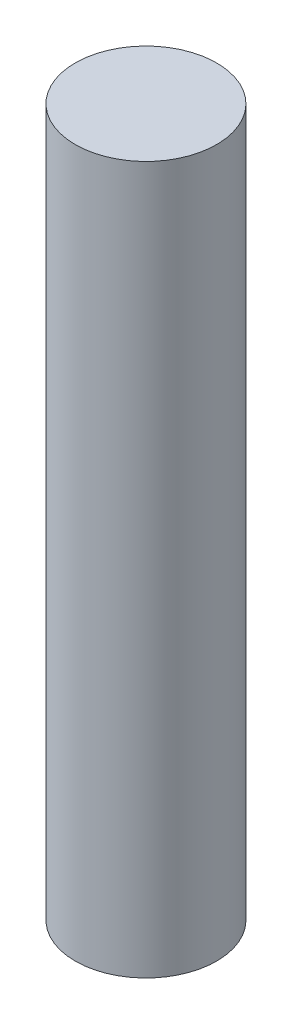
ISO-10303-21;
HEADER;
FILE_DESCRIPTION(('STEP AP214'),'2;1');
FILE_NAME('part.step','',(''),(''),'','','');
FILE_SCHEMA(('AUTOMOTIVE_DESIGN { 1 0 10303 214 1 1 1 1 }'));
ENDSEC;
DATA;
#1=APPLICATION_CONTEXT('core data for automotive mechanical design processes');
#2=APPLICATION_PROTOCOL_DEFINITION('international standard','automotive_design',2000,#1);
#3=PRODUCT_CONTEXT('',#1,'mechanical');
#4=PRODUCT('Part','Part','',(#3));
#5=PRODUCT_RELATED_PRODUCT_CATEGORY('part','',(#4));
#6=PRODUCT_DEFINITION_FORMATION('','',#4);
#7=PRODUCT_DEFINITION_CONTEXT('part definition',#1,'design');
#8=PRODUCT_DEFINITION('design','',#6,#7);
#9=PRODUCT_DEFINITION_SHAPE('','',#8);
#10=(LENGTH_UNIT() NAMED_UNIT(*) SI_UNIT(.MILLI.,.METRE.));
#11=(NAMED_UNIT(*) PLANE_ANGLE_UNIT() SI_UNIT($,.RADIAN.));
#12=(NAMED_UNIT(*) SI_UNIT($,.STERADIAN.) SOLID_ANGLE_UNIT());
#13=UNCERTAINTY_MEASURE_WITH_UNIT(LENGTH_MEASURE(1.E-05),#10,'distance_accuracy_value','');
#14=(GEOMETRIC_REPRESENTATION_CONTEXT(3) GLOBAL_UNCERTAINTY_ASSIGNED_CONTEXT((#13)) GLOBAL_UNIT_ASSIGNED_CONTEXT((#10,
#11,#12)) REPRESENTATION_CONTEXT('',''));
#15=CARTESIAN_POINT('',(0.,0.,0.));
#16=DIRECTION('',(0.,0.,1.));
#17=DIRECTION('',(1.,0.,0.));
#18=AXIS2_PLACEMENT_3D('',#15,#16,#17);
#19=CARTESIAN_POINT('',(0.,13.97,0.));
#20=DIRECTION('',(0.,-1.,0.));
#21=DIRECTION('',(0.,0.,-1.));
#22=AXIS2_PLACEMENT_3D('',#19,#20,#21);
#23=CYLINDRICAL_SURFACE('',#22,1.397);
#24=CARTESIAN_POINT('',(0.,13.97,0.));
#25=DIRECTION('',(0.,1.,0.));
#26=DIRECTION('',(0.,0.,1.));
#27=AXIS2_PLACEMENT_3D('',#24,#25,#26);
#28=CIRCLE('',#27,1.397);
#29=CARTESIAN_POINT('',(0.,13.97,1.397));
#30=VERTEX_POINT('',#29);
#31=EDGE_CURVE('E10',#30,#30,#28,.T.);
#32=ORIENTED_EDGE('',*,*,#31,.F.);
#33=EDGE_LOOP('',(#32));
#34=FACE_BOUND('',#33,.T.);
#35=CARTESIAN_POINT('',(0.,0.,0.));
#36=DIRECTION('',(0.,1.,0.));
#37=DIRECTION('',(0.,0.,1.));
#38=AXIS2_PLACEMENT_3D('',#35,#36,#37);
#39=CIRCLE('',#38,1.397);
#40=CARTESIAN_POINT('',(0.,0.,1.397));
#41=VERTEX_POINT('',#40);
#42=EDGE_CURVE('E40',#41,#41,#39,.T.);
#43=ORIENTED_EDGE('',*,*,#42,.T.);
#44=EDGE_LOOP('',(#43));
#45=FACE_BOUND('',#44,.T.);
#46=ADVANCED_FACE('F37',(#34,#45),#23,.T.);
#47=CARTESIAN_POINT('',(0.,13.97,0.));
#48=DIRECTION('',(0.,1.,0.));
#49=DIRECTION('',(0.,0.,1.));
#50=AXIS2_PLACEMENT_3D('',#47,#48,#49);
#51=PLANE('',#50);
#52=ORIENTED_EDGE('',*,*,#31,.T.);
#53=EDGE_LOOP('',(#52));
#54=FACE_BOUND('',#53,.T.);
#55=ADVANCED_FACE('F54',(#54),#51,.T.);
#56=CARTESIAN_POINT('',(0.,0.,0.));
#57=DIRECTION('',(0.,1.,0.));
#58=DIRECTION('',(0.,0.,1.));
#59=AXIS2_PLACEMENT_3D('',#56,#57,#58);
#60=PLANE('',#59);
#61=ORIENTED_EDGE('',*,*,#42,.F.);
#62=EDGE_LOOP('',(#61));
#63=FACE_BOUND('',#62,.T.);
#64=ADVANCED_FACE('F52',(#63),#60,.F.);
#65=CLOSED_SHELL('',(#46,#55,#64));
#66=MANIFOLD_SOLID_BREP('B2',#65);
#67=ADVANCED_BREP_SHAPE_REPRESENTATION('',(#18,#66),#14);
#68=SHAPE_DEFINITION_REPRESENTATION(#9,#67);
ENDSEC;
END-ISO-10303-21;
